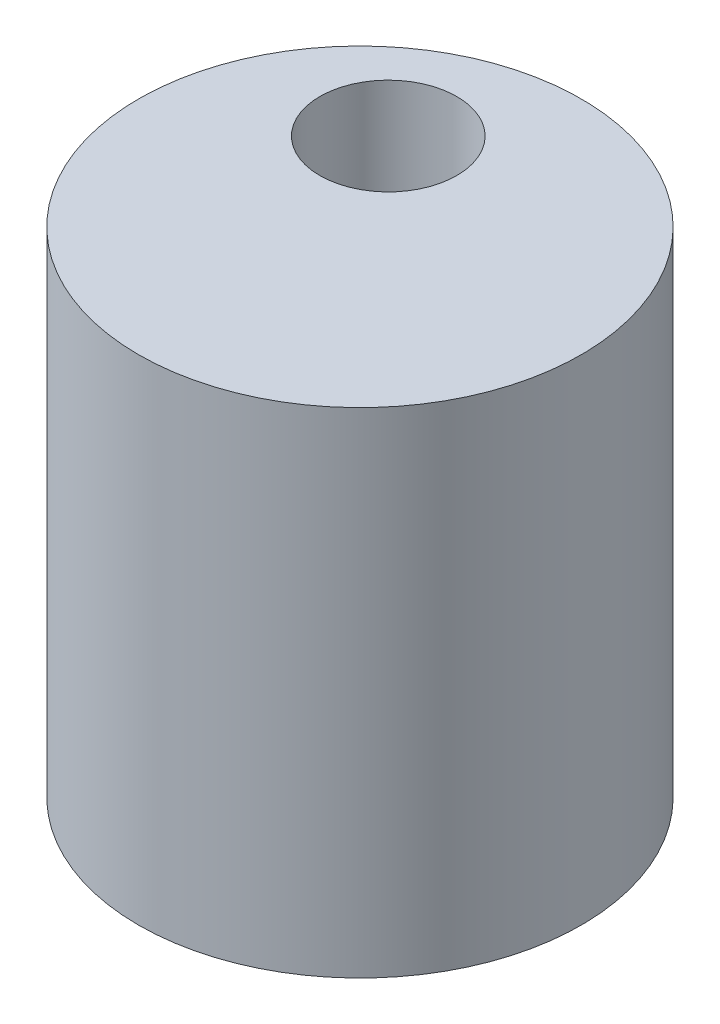
ISO-10303-21;
HEADER;
FILE_DESCRIPTION(('STEP AP214'),'2;1');
FILE_NAME('part.step','',(''),(''),'','','');
FILE_SCHEMA(('AUTOMOTIVE_DESIGN { 1 0 10303 214 1 1 1 1 }'));
ENDSEC;
DATA;
#1=APPLICATION_CONTEXT('core data for automotive mechanical design processes');
#2=APPLICATION_PROTOCOL_DEFINITION('international standard','automotive_design',2000,#1);
#3=PRODUCT_CONTEXT('',#1,'mechanical');
#4=PRODUCT('Part','Part','',(#3));
#5=PRODUCT_RELATED_PRODUCT_CATEGORY('part','',(#4));
#6=PRODUCT_DEFINITION_FORMATION('','',#4);
#7=PRODUCT_DEFINITION_CONTEXT('part definition',#1,'design');
#8=PRODUCT_DEFINITION('design','',#6,#7);
#9=PRODUCT_DEFINITION_SHAPE('','',#8);
#10=(LENGTH_UNIT() NAMED_UNIT(*) SI_UNIT(.MILLI.,.METRE.));
#11=(NAMED_UNIT(*) PLANE_ANGLE_UNIT() SI_UNIT($,.RADIAN.));
#12=(NAMED_UNIT(*) SI_UNIT($,.STERADIAN.) SOLID_ANGLE_UNIT());
#13=UNCERTAINTY_MEASURE_WITH_UNIT(LENGTH_MEASURE(1.E-05),#10,'distance_accuracy_value','');
#14=(GEOMETRIC_REPRESENTATION_CONTEXT(3) GLOBAL_UNCERTAINTY_ASSIGNED_CONTEXT((#13)) GLOBAL_UNIT_ASSIGNED_CONTEXT((#10,
#11,#12)) REPRESENTATION_CONTEXT('',''));
#15=CARTESIAN_POINT('',(0.,0.,0.));
#16=DIRECTION('',(0.,0.,1.));
#17=DIRECTION('',(1.,0.,0.));
#18=AXIS2_PLACEMENT_3D('',#15,#16,#17);
#19=CARTESIAN_POINT('',(0.,-29.21,0.));
#20=DIRECTION('',(0.,1.,0.));
#21=DIRECTION('',(0.,0.,1.));
#22=AXIS2_PLACEMENT_3D('',#19,#20,#21);
#23=CYLINDRICAL_SURFACE('',#22,13.0937);
#24=CARTESIAN_POINT('',(0.,-29.21,0.));
#25=DIRECTION('',(0.,1.,0.));
#26=DIRECTION('',(0.,0.,1.));
#27=AXIS2_PLACEMENT_3D('',#24,#25,#26);
#28=CIRCLE('',#27,13.0937);
#29=CARTESIAN_POINT('',(0.,-29.21,13.0937));
#30=VERTEX_POINT('',#29);
#31=EDGE_CURVE('E10',#30,#30,#28,.T.);
#32=CARTESIAN_POINT('',(0.,0.,0.));
#33=DIRECTION('',(0.,1.,0.));
#34=DIRECTION('',(0.,0.,1.));
#35=AXIS2_PLACEMENT_3D('',#32,#33,#34);
#36=CIRCLE('',#35,13.0937);
#37=CARTESIAN_POINT('',(0.,0.,13.0937));
#38=VERTEX_POINT('',#37);
#39=EDGE_CURVE('E42',#38,#38,#36,.T.);
#40=CARTESIAN_POINT('',(0.,-29.21,13.0937));
#41=CARTESIAN_POINT('',(0.,-28.9057291666667,13.0937));
#42=CARTESIAN_POINT('',(0.,-28.6014583333333,13.0937));
#43=CARTESIAN_POINT('',(0.,-27.9929166666667,13.0937));
#44=CARTESIAN_POINT('',(0.,-27.6886458333333,13.0937));
#45=CARTESIAN_POINT('',(0.,-27.0801041666667,13.0937));
#46=CARTESIAN_POINT('',(0.,-26.7758333333333,13.0937));
#47=CARTESIAN_POINT('',(0.,-26.1672916666667,13.0937));
#48=CARTESIAN_POINT('',(0.,-25.8630208333333,13.0937));
#49=CARTESIAN_POINT('',(0.,-25.2544791666667,13.0937));
#50=CARTESIAN_POINT('',(0.,-24.9502083333333,13.0937));
#51=CARTESIAN_POINT('',(0.,-24.3416666666667,13.0937));
#52=CARTESIAN_POINT('',(0.,-24.0373958333333,13.0937));
#53=CARTESIAN_POINT('',(0.,-23.4288541666667,13.0937));
#54=CARTESIAN_POINT('',(0.,-23.1245833333333,13.0937));
#55=CARTESIAN_POINT('',(0.,-22.5160416666667,13.0937));
#56=CARTESIAN_POINT('',(0.,-22.2117708333333,13.0937));
#57=CARTESIAN_POINT('',(0.,-21.6032291666667,13.0937));
#58=CARTESIAN_POINT('',(0.,-21.2989583333333,13.0937));
#59=CARTESIAN_POINT('',(0.,-20.6904166666667,13.0937));
#60=CARTESIAN_POINT('',(0.,-20.3861458333333,13.0937));
#61=CARTESIAN_POINT('',(0.,-19.7776041666667,13.0937));
#62=CARTESIAN_POINT('',(0.,-19.4733333333333,13.0937));
#63=CARTESIAN_POINT('',(0.,-18.8647916666667,13.0937));
#64=CARTESIAN_POINT('',(0.,-18.5605208333333,13.0937));
#65=CARTESIAN_POINT('',(0.,-17.9519791666667,13.0937));
#66=CARTESIAN_POINT('',(0.,-17.6477083333333,13.0937));
#67=CARTESIAN_POINT('',(0.,-17.0391666666667,13.0937));
#68=CARTESIAN_POINT('',(0.,-16.7348958333333,13.0937));
#69=CARTESIAN_POINT('',(0.,-16.1263541666667,13.0937));
#70=CARTESIAN_POINT('',(0.,-15.8220833333333,13.0937));
#71=CARTESIAN_POINT('',(0.,-15.2135416666667,13.0937));
#72=CARTESIAN_POINT('',(0.,-14.9092708333333,13.0937));
#73=CARTESIAN_POINT('',(0.,-14.3007291666667,13.0937));
#74=CARTESIAN_POINT('',(0.,-13.9964583333333,13.0937));
#75=CARTESIAN_POINT('',(0.,-13.3879166666667,13.0937));
#76=CARTESIAN_POINT('',(0.,-13.0836458333333,13.0937));
#77=CARTESIAN_POINT('',(0.,-12.4751041666667,13.0937));
#78=CARTESIAN_POINT('',(0.,-12.1708333333333,13.0937));
#79=CARTESIAN_POINT('',(0.,-11.5622916666667,13.0937));
#80=CARTESIAN_POINT('',(0.,-11.2580208333333,13.0937));
#81=CARTESIAN_POINT('',(0.,-10.6494791666667,13.0937));
#82=CARTESIAN_POINT('',(0.,-10.3452083333333,13.0937));
#83=CARTESIAN_POINT('',(0.,-9.73666666666667,13.0937));
#84=CARTESIAN_POINT('',(0.,-9.43239583333333,13.0937));
#85=CARTESIAN_POINT('',(0.,-8.82385416666667,13.0937));
#86=CARTESIAN_POINT('',(0.,-8.51958333333334,13.0937));
#87=CARTESIAN_POINT('',(0.,-7.91104166666667,13.0937));
#88=CARTESIAN_POINT('',(0.,-7.60677083333333,13.0937));
#89=CARTESIAN_POINT('',(0.,-6.99822916666667,13.0937));
#90=CARTESIAN_POINT('',(0.,-6.69395833333333,13.0937));
#91=CARTESIAN_POINT('',(0.,-6.08541666666667,13.0937));
#92=CARTESIAN_POINT('',(0.,-5.78114583333333,13.0937));
#93=CARTESIAN_POINT('',(0.,-5.17260416666667,13.0937));
#94=CARTESIAN_POINT('',(0.,-4.86833333333333,13.0937));
#95=CARTESIAN_POINT('',(0.,-4.25979166666667,13.0937));
#96=CARTESIAN_POINT('',(0.,-3.95552083333333,13.0937));
#97=CARTESIAN_POINT('',(0.,-3.34697916666667,13.0937));
#98=CARTESIAN_POINT('',(0.,-3.04270833333333,13.0937));
#99=CARTESIAN_POINT('',(0.,-2.43416666666667,13.0937));
#100=CARTESIAN_POINT('',(0.,-2.12989583333333,13.0937));
#101=CARTESIAN_POINT('',(0.,-1.52135416666667,13.0937));
#102=CARTESIAN_POINT('',(0.,-1.21708333333333,13.0937));
#103=CARTESIAN_POINT('',(0.,-0.608541666666666,13.0937));
#104=CARTESIAN_POINT('',(0.,-0.304270833333333,13.0937));
#105=CARTESIAN_POINT('',(0.,0.,13.0937));
#106=B_SPLINE_CURVE_WITH_KNOTS('',3,(#40,#41,#42,#43,#44,#45,#46,#47,#48,#49,#50,#51,#52,#53,
#54,#55,#56,#57,#58,#59,#60,#61,#62,#63,#64,#65,#66,#67,#68,#69,#70,#71,#72,#73,#74,#75,#76,#77,
#78,#79,#80,#81,#82,#83,#84,#85,#86,#87,#88,#89,#90,#91,#92,#93,#94,#95,#96,#97,#98,#99,#100,
#101,#102,#103,#104,#105),.UNSPECIFIED.,.F.,.F.,(4,2,2,2,2,2,2,2,2,2,2,2,2,2,2,2,2,2,2,2,2,2,2,
2,2,2,2,2,2,2,2,2,4),(0.,0.912812500000002,1.825625,2.7384375,3.65125,4.5640625,5.476875,
6.3896875,7.3025,8.2153125,9.128125,10.0409375,10.95375,11.8665625,12.779375,13.6921875,14.605,
15.5178125,16.430625,17.3434375,18.25625,19.1690625,20.081875,20.9946875,21.9075,22.8203125,
23.733125,24.6459375,25.55875,26.4715625,27.384375,28.2971875,29.21),.UNSPECIFIED.);
#107=EDGE_CURVE('BSEAM39',#30,#38,#106,.T.);
#108=ORIENTED_EDGE('',*,*,#31,.T.);
#109=ORIENTED_EDGE('',*,*,#39,.F.);
#110=ORIENTED_EDGE('',*,*,#107,.T.);
#111=ORIENTED_EDGE('',*,*,#107,.F.);
#112=EDGE_LOOP('',(#108,#110,#109,#111));
#113=FACE_BOUND('',#112,.T.);
#114=ADVANCED_FACE('F39',(#113),#23,.T.);
#115=CARTESIAN_POINT('',(0.,-29.21,0.));
#116=DIRECTION('',(0.,1.,0.));
#117=DIRECTION('',(0.,0.,1.));
#118=AXIS2_PLACEMENT_3D('',#115,#116,#117);
#119=PLANE('',#118);
#120=CARTESIAN_POINT('',(-3.81,-29.21,-5.4864));
#121=DIRECTION('',(0.,1.,0.));
#122=DIRECTION('',(0.,0.,1.));
#123=AXIS2_PLACEMENT_3D('',#120,#121,#122);
#124=CIRCLE('',#123,4.05);
#125=CARTESIAN_POINT('',(-3.81,-29.21,-1.4364));
#126=VERTEX_POINT('',#125);
#127=EDGE_CURVE('E49',#126,#126,#124,.T.);
#128=ORIENTED_EDGE('',*,*,#127,.T.);
#129=EDGE_LOOP('',(#128));
#130=FACE_BOUND('',#129,.T.);
#131=ORIENTED_EDGE('',*,*,#31,.F.);
#132=EDGE_LOOP('',(#131));
#133=FACE_BOUND('',#132,.T.);
#134=ADVANCED_FACE('F57',(#130,#133),#119,.F.);
#135=CARTESIAN_POINT('',(0.,0.,0.));
#136=DIRECTION('',(0.,1.,0.));
#137=DIRECTION('',(0.,0.,1.));
#138=AXIS2_PLACEMENT_3D('',#135,#136,#137);
#139=PLANE('',#138);
#140=CARTESIAN_POINT('',(-3.81,0.,-5.4864));
#141=DIRECTION('',(0.,1.,0.));
#142=DIRECTION('',(0.,0.,1.));
#143=AXIS2_PLACEMENT_3D('',#140,#141,#142);
#144=CIRCLE('',#143,4.05);
#145=CARTESIAN_POINT('',(-3.81,0.,-1.4364));
#146=VERTEX_POINT('',#145);
#147=EDGE_CURVE('E51',#146,#146,#144,.T.);
#148=ORIENTED_EDGE('',*,*,#147,.F.);
#149=EDGE_LOOP('',(#148));
#150=FACE_BOUND('',#149,.T.);
#151=ORIENTED_EDGE('',*,*,#39,.T.);
#152=EDGE_LOOP('',(#151));
#153=FACE_BOUND('',#152,.T.);
#154=ADVANCED_FACE('F63',(#150,#153),#139,.T.);
#155=CARTESIAN_POINT('',(-3.81,-29.21,-5.4864));
#156=DIRECTION('',(0.,1.,0.));
#157=DIRECTION('',(0.,0.,1.));
#158=AXIS2_PLACEMENT_3D('',#155,#156,#157);
#159=CYLINDRICAL_SURFACE('',#158,4.05);
#160=CARTESIAN_POINT('',(-3.81,-29.21,-1.4364));
#161=CARTESIAN_POINT('',(-3.81,-28.9057291666667,-1.4364));
#162=CARTESIAN_POINT('',(-3.81,-28.6014583333333,-1.4364));
#163=CARTESIAN_POINT('',(-3.81,-27.9929166666667,-1.4364));
#164=CARTESIAN_POINT('',(-3.81,-27.6886458333333,-1.4364));
#165=CARTESIAN_POINT('',(-3.81,-27.0801041666667,-1.4364));
#166=CARTESIAN_POINT('',(-3.81,-26.7758333333333,-1.4364));
#167=CARTESIAN_POINT('',(-3.81,-26.1672916666667,-1.4364));
#168=CARTESIAN_POINT('',(-3.81,-25.8630208333333,-1.4364));
#169=CARTESIAN_POINT('',(-3.81,-25.2544791666667,-1.4364));
#170=CARTESIAN_POINT('',(-3.81,-24.9502083333333,-1.4364));
#171=CARTESIAN_POINT('',(-3.81,-24.3416666666667,-1.4364));
#172=CARTESIAN_POINT('',(-3.81,-24.0373958333333,-1.4364));
#173=CARTESIAN_POINT('',(-3.81,-23.4288541666667,-1.4364));
#174=CARTESIAN_POINT('',(-3.81,-23.1245833333333,-1.4364));
#175=CARTESIAN_POINT('',(-3.81,-22.5160416666667,-1.4364));
#176=CARTESIAN_POINT('',(-3.81,-22.2117708333333,-1.4364));
#177=CARTESIAN_POINT('',(-3.81,-21.6032291666667,-1.4364));
#178=CARTESIAN_POINT('',(-3.81,-21.2989583333333,-1.4364));
#179=CARTESIAN_POINT('',(-3.81,-20.6904166666667,-1.4364));
#180=CARTESIAN_POINT('',(-3.81,-20.3861458333333,-1.4364));
#181=CARTESIAN_POINT('',(-3.81,-19.7776041666667,-1.4364));
#182=CARTESIAN_POINT('',(-3.81,-19.4733333333333,-1.4364));
#183=CARTESIAN_POINT('',(-3.81,-18.8647916666667,-1.4364));
#184=CARTESIAN_POINT('',(-3.81,-18.5605208333333,-1.4364));
#185=CARTESIAN_POINT('',(-3.81,-17.9519791666667,-1.4364));
#186=CARTESIAN_POINT('',(-3.81,-17.6477083333333,-1.4364));
#187=CARTESIAN_POINT('',(-3.81,-17.0391666666667,-1.4364));
#188=CARTESIAN_POINT('',(-3.81,-16.7348958333333,-1.4364));
#189=CARTESIAN_POINT('',(-3.81,-16.1263541666667,-1.4364));
#190=CARTESIAN_POINT('',(-3.81,-15.8220833333333,-1.4364));
#191=CARTESIAN_POINT('',(-3.81,-15.2135416666667,-1.4364));
#192=CARTESIAN_POINT('',(-3.81,-14.9092708333333,-1.4364));
#193=CARTESIAN_POINT('',(-3.81,-14.3007291666667,-1.4364));
#194=CARTESIAN_POINT('',(-3.81,-13.9964583333333,-1.4364));
#195=CARTESIAN_POINT('',(-3.81,-13.3879166666667,-1.4364));
#196=CARTESIAN_POINT('',(-3.81,-13.0836458333333,-1.4364));
#197=CARTESIAN_POINT('',(-3.81,-12.4751041666667,-1.4364));
#198=CARTESIAN_POINT('',(-3.81,-12.1708333333333,-1.4364));
#199=CARTESIAN_POINT('',(-3.81,-11.5622916666667,-1.4364));
#200=CARTESIAN_POINT('',(-3.81,-11.2580208333333,-1.4364));
#201=CARTESIAN_POINT('',(-3.81,-10.6494791666667,-1.4364));
#202=CARTESIAN_POINT('',(-3.81,-10.3452083333333,-1.4364));
#203=CARTESIAN_POINT('',(-3.81,-9.73666666666667,-1.4364));
#204=CARTESIAN_POINT('',(-3.81,-9.43239583333333,-1.4364));
#205=CARTESIAN_POINT('',(-3.81,-8.82385416666667,-1.4364));
#206=CARTESIAN_POINT('',(-3.81,-8.51958333333333,-1.4364));
#207=CARTESIAN_POINT('',(-3.81,-7.91104166666666,-1.4364));
#208=CARTESIAN_POINT('',(-3.81,-7.60677083333333,-1.4364));
#209=CARTESIAN_POINT('',(-3.81,-6.99822916666667,-1.4364));
#210=CARTESIAN_POINT('',(-3.81,-6.69395833333333,-1.4364));
#211=CARTESIAN_POINT('',(-3.81,-6.08541666666667,-1.4364));
#212=CARTESIAN_POINT('',(-3.81,-5.78114583333333,-1.4364));
#213=CARTESIAN_POINT('',(-3.81,-5.17260416666667,-1.4364));
#214=CARTESIAN_POINT('',(-3.81,-4.86833333333333,-1.4364));
#215=CARTESIAN_POINT('',(-3.81,-4.25979166666667,-1.4364));
#216=CARTESIAN_POINT('',(-3.81,-3.95552083333333,-1.4364));
#217=CARTESIAN_POINT('',(-3.81,-3.34697916666667,-1.4364));
#218=CARTESIAN_POINT('',(-3.81,-3.04270833333333,-1.4364));
#219=CARTESIAN_POINT('',(-3.81,-2.43416666666667,-1.4364));
#220=CARTESIAN_POINT('',(-3.81,-2.12989583333333,-1.4364));
#221=CARTESIAN_POINT('',(-3.81,-1.52135416666667,-1.4364));
#222=CARTESIAN_POINT('',(-3.81,-1.21708333333333,-1.4364));
#223=CARTESIAN_POINT('',(-3.81,-0.608541666666666,-1.4364));
#224=CARTESIAN_POINT('',(-3.81,-0.304270833333333,-1.4364));
#225=CARTESIAN_POINT('',(-3.81,0.,-1.4364));
#226=B_SPLINE_CURVE_WITH_KNOTS('',3,(#160,#161,#162,#163,#164,#165,#166,#167,#168,#169,#170,
#171,#172,#173,#174,#175,#176,#177,#178,#179,#180,#181,#182,#183,#184,#185,#186,#187,#188,#189,
#190,#191,#192,#193,#194,#195,#196,#197,#198,#199,#200,#201,#202,#203,#204,#205,#206,#207,#208,
#209,#210,#211,#212,#213,#214,#215,#216,#217,#218,#219,#220,#221,#222,#223,#224,#225),
.UNSPECIFIED.,.F.,.F.,(4,2,2,2,2,2,2,2,2,2,2,2,2,2,2,2,2,2,2,2,2,2,2,2,2,2,2,2,2,2,2,2,4),(0.,
0.912812499999999,1.825625,2.7384375,3.65125,4.5640625,5.476875,6.3896875,7.3025,8.2153125,
9.128125,10.0409375,10.95375,11.8665625,12.779375,13.6921875,14.605,15.5178125,16.430625,
17.3434375,18.25625,19.1690625,20.081875,20.9946875,21.9075,22.8203125,23.733125,24.6459375,
25.55875,26.4715625,27.384375,28.2971875,29.21),.UNSPECIFIED.);
#227=EDGE_CURVE('BSEAM60',#126,#146,#226,.T.);
#228=ORIENTED_EDGE('',*,*,#127,.F.);
#229=ORIENTED_EDGE('',*,*,#147,.T.);
#230=ORIENTED_EDGE('',*,*,#227,.T.);
#231=ORIENTED_EDGE('',*,*,#227,.F.);
#232=EDGE_LOOP('',(#228,#230,#229,#231));
#233=FACE_BOUND('',#232,.T.);
#234=ADVANCED_FACE('F60',(#233),#159,.F.);
#235=CLOSED_SHELL('',(#114,#134,#154,#234));
#236=MANIFOLD_SOLID_BREP('B2',#235);
#237=ADVANCED_BREP_SHAPE_REPRESENTATION('',(#18,#236),#14);
#238=SHAPE_DEFINITION_REPRESENTATION(#9,#237);
ENDSEC;
END-ISO-10303-21;
